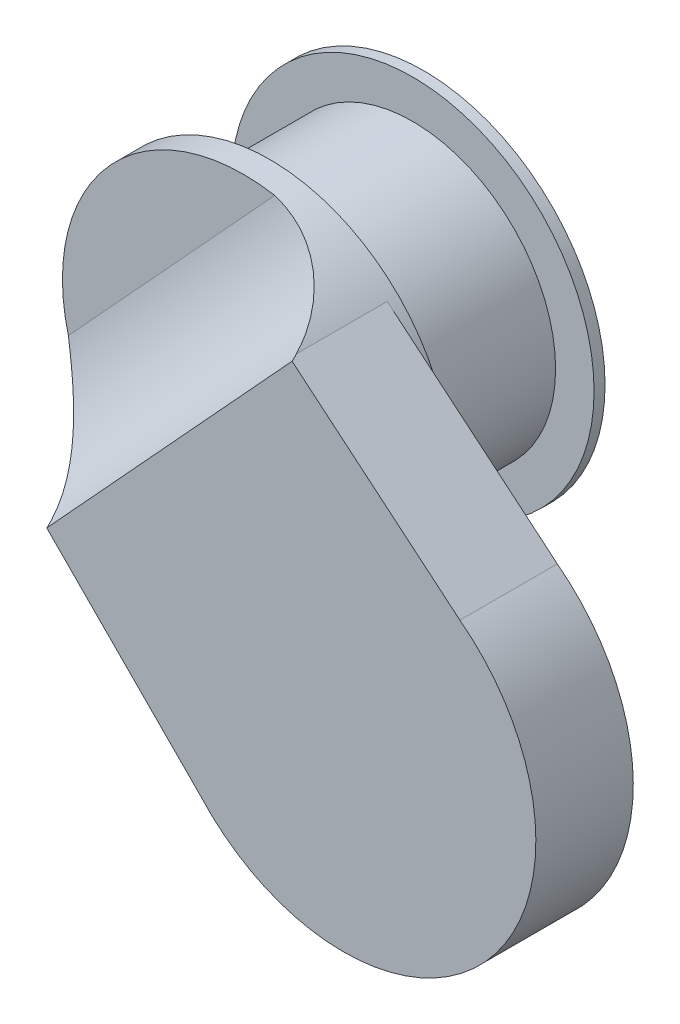
ISO-10303-21;
HEADER;
FILE_DESCRIPTION(('STEP AP214'),'2;1');
FILE_NAME('part.step','',(''),(''),'','','');
FILE_SCHEMA(('AUTOMOTIVE_DESIGN { 1 0 10303 214 1 1 1 1 }'));
ENDSEC;
DATA;
#1=APPLICATION_CONTEXT('core data for automotive mechanical design processes');
#2=APPLICATION_PROTOCOL_DEFINITION('international standard','automotive_design',2000,#1);
#3=PRODUCT_CONTEXT('',#1,'mechanical');
#4=PRODUCT('Part','Part','',(#3));
#5=PRODUCT_RELATED_PRODUCT_CATEGORY('part','',(#4));
#6=PRODUCT_DEFINITION_FORMATION('','',#4);
#7=PRODUCT_DEFINITION_CONTEXT('part definition',#1,'design');
#8=PRODUCT_DEFINITION('design','',#6,#7);
#9=PRODUCT_DEFINITION_SHAPE('','',#8);
#10=(LENGTH_UNIT() NAMED_UNIT(*) SI_UNIT(.MILLI.,.METRE.));
#11=(NAMED_UNIT(*) PLANE_ANGLE_UNIT() SI_UNIT($,.RADIAN.));
#12=(NAMED_UNIT(*) SI_UNIT($,.STERADIAN.) SOLID_ANGLE_UNIT());
#13=UNCERTAINTY_MEASURE_WITH_UNIT(LENGTH_MEASURE(1.E-05),#10,'distance_accuracy_value','');
#14=(GEOMETRIC_REPRESENTATION_CONTEXT(3) GLOBAL_UNCERTAINTY_ASSIGNED_CONTEXT((#13)) GLOBAL_UNIT_ASSIGNED_CONTEXT((#10,
#11,#12)) REPRESENTATION_CONTEXT('',''));
#15=CARTESIAN_POINT('',(0.,0.,0.));
#16=DIRECTION('',(0.,0.,1.));
#17=DIRECTION('',(1.,0.,0.));
#18=AXIS2_PLACEMENT_3D('',#15,#16,#17);
#19=CARTESIAN_POINT('',(-57.4368069571639,52.7732243336127,-361.102462775354));
#20=DIRECTION('',(0.,0.,-1.));
#21=DIRECTION('',(-1.,0.,0.));
#22=AXIS2_PLACEMENT_3D('',#19,#20,#21);
#23=PLANE('',#22);
#24=CARTESIAN_POINT('',(-33.1366193983653,30.4460909616992,-361.102462775354));
#25=DIRECTION('',(0.,0.,1.));
#26=DIRECTION('',(1.,0.,0.));
#27=AXIS2_PLACEMENT_3D('',#24,#25,#26);
#28=CIRCLE('',#27,33.);
#29=CARTESIAN_POINT('',(-0.136619398365269,30.4460909616992,-361.102462775354));
#30=VERTEX_POINT('',#29);
#31=EDGE_CURVE('E20',#30,#30,#28,.T.);
#32=ORIENTED_EDGE('',*,*,#31,.F.);
#33=EDGE_LOOP('',(#32));
#34=FACE_BOUND('',#33,.T.);
#35=ADVANCED_FACE('F17',(#34),#23,.T.);
#36=CARTESIAN_POINT('',(-33.1366193983653,30.4460909616992,71.4239086191774));
#37=DIRECTION('',(0.,0.,1.));
#38=DIRECTION('',(1.,0.,0.));
#39=AXIS2_PLACEMENT_3D('',#36,#37,#38);
#40=CYLINDRICAL_SURFACE('',#39,33.);
#41=CARTESIAN_POINT('',(-33.1366193983653,30.4460909616992,-359.102462775354));
#42=DIRECTION('',(0.,0.,1.));
#43=DIRECTION('',(1.,0.,0.));
#44=AXIS2_PLACEMENT_3D('',#41,#42,#43);
#45=CIRCLE('',#44,33.);
#46=CARTESIAN_POINT('',(-0.136619398365269,30.4460909616992,-359.102462775354));
#47=VERTEX_POINT('',#46);
#48=EDGE_CURVE('E188',#47,#47,#45,.T.);
#49=ORIENTED_EDGE('',*,*,#48,.F.);
#50=EDGE_LOOP('',(#49));
#51=FACE_BOUND('',#50,.T.);
#52=ORIENTED_EDGE('',*,*,#31,.T.);
#53=EDGE_LOOP('',(#52));
#54=FACE_BOUND('',#53,.T.);
#55=ADVANCED_FACE('F145',(#51,#54),#40,.T.);
#56=CARTESIAN_POINT('',(-52.2822217174187,48.0371657395704,-359.102462775354));
#57=DIRECTION('',(0.,0.,1.));
#58=DIRECTION('',(0.,-1.,0.));
#59=AXIS2_PLACEMENT_3D('',#56,#57,#58);
#60=PLANE('',#59);
#61=CARTESIAN_POINT('',(-33.1366193983653,30.4460909616992,-359.102462775354));
#62=DIRECTION('',(0.,0.,1.));
#63=DIRECTION('',(1.,0.,0.));
#64=AXIS2_PLACEMENT_3D('',#61,#62,#63);
#65=CIRCLE('',#64,25.9999999999999);
#66=CARTESIAN_POINT('',(-7.13661939836536,30.4460909616992,-359.102462775354));
#67=VERTEX_POINT('',#66);
#68=EDGE_CURVE('E184',#67,#67,#65,.T.);
#69=ORIENTED_EDGE('',*,*,#68,.F.);
#70=EDGE_LOOP('',(#69));
#71=FACE_BOUND('',#70,.T.);
#72=ORIENTED_EDGE('',*,*,#48,.T.);
#73=EDGE_LOOP('',(#72));
#74=FACE_BOUND('',#73,.T.);
#75=ADVANCED_FACE('F142',(#71,#74),#60,.T.);
#76=CARTESIAN_POINT('',(-33.1366193983653,30.4460909616992,71.4239086191774));
#77=DIRECTION('',(0.,0.,1.));
#78=DIRECTION('',(1.,0.,0.));
#79=AXIS2_PLACEMENT_3D('',#76,#77,#78);
#80=CYLINDRICAL_SURFACE('',#79,25.9999999999999);
#81=CARTESIAN_POINT('',(-33.1366193983653,30.4460909616992,-333.102462775354));
#82=DIRECTION('',(0.,0.,1.));
#83=DIRECTION('',(1.,0.,0.));
#84=AXIS2_PLACEMENT_3D('',#81,#82,#83);
#85=CIRCLE('',#84,25.9999999999999);
#86=CARTESIAN_POINT('',(-7.13661939836536,30.4460909616992,-333.102462775354));
#87=VERTEX_POINT('',#86);
#88=EDGE_CURVE('E181',#87,#87,#85,.T.);
#89=ORIENTED_EDGE('',*,*,#88,.F.);
#90=EDGE_LOOP('',(#89));
#91=FACE_BOUND('',#90,.T.);
#92=ORIENTED_EDGE('',*,*,#68,.T.);
#93=EDGE_LOOP('',(#92));
#94=FACE_BOUND('',#93,.T.);
#95=ADVANCED_FACE('F138',(#91,#94),#80,.T.);
#96=CARTESIAN_POINT('',(-52.2822217174187,48.0371657395704,-333.102462775354));
#97=DIRECTION('',(0.,0.,-1.));
#98=DIRECTION('',(-1.,0.,0.));
#99=AXIS2_PLACEMENT_3D('',#96,#97,#98);
#100=PLANE('',#99);
#101=CARTESIAN_POINT('',(-33.1366193983653,30.4460909616992,-333.102462775354));
#102=DIRECTION('',(0.,0.,1.));
#103=DIRECTION('',(1.,0.,0.));
#104=AXIS2_PLACEMENT_3D('',#101,#102,#103);
#105=CIRCLE('',#104,33.);
#106=CARTESIAN_POINT('',(-0.136619398365269,30.4460909616992,-333.102462775354));
#107=VERTEX_POINT('',#106);
#108=EDGE_CURVE('E79',#107,#107,#105,.T.);
#109=ORIENTED_EDGE('',*,*,#108,.F.);
#110=EDGE_LOOP('',(#109));
#111=FACE_BOUND('',#110,.T.);
#112=ORIENTED_EDGE('',*,*,#88,.T.);
#113=EDGE_LOOP('',(#112));
#114=FACE_BOUND('',#113,.T.);
#115=ADVANCED_FACE('F134',(#111,#114),#100,.T.);
#116=CARTESIAN_POINT('',(-26.9907159954637,85.9098437319744,-328.369237082393));
#117=DIRECTION('',(0.,0.,-1.));
#118=DIRECTION('',(-1.,0.,0.));
#119=AXIS2_PLACEMENT_3D('',#116,#117,#118);
#120=PLANE('',#119);
#121=CARTESIAN_POINT('',(-33.1366193983653,30.4460909616992,-328.369237082393));
#122=DIRECTION('',(0.,0.,1.));
#123=DIRECTION('',(1.,0.,0.));
#124=AXIS2_PLACEMENT_3D('',#121,#122,#123);
#125=CIRCLE('',#124,33.);
#126=CARTESIAN_POINT('',(-65.060484230888,22.0874514698428,-328.369237082393));
#127=VERTEX_POINT('',#126);
#128=CARTESIAN_POINT('',(-27.5047740204313,62.9619688929353,-328.369237082393));
#129=VERTEX_POINT('',#128);
#130=EDGE_CURVE('E80',#127,#129,#125,.F.);
#131=ORIENTED_EDGE('',*,*,#130,.F.);
#132=DIRECTION('',(-0.676579799148893,-0.736369319963593,0.));
#133=VECTOR('',#132,1.);
#134=CARTESIAN_POINT('',(-15.8365381639597,75.6613295797509,-328.369237082393));
#135=LINE('',#134,#133);
#136=EDGE_CURVE('E100',#127,#129,#135,.F.);
#137=ORIENTED_EDGE('',*,*,#136,.T.);
#138=EDGE_LOOP('',(#131,#137));
#139=FACE_BOUND('',#138,.T.);
#140=ADVANCED_FACE('F131',(#139),#120,.F.);
#141=CARTESIAN_POINT('',(-3.60955709766131E-12,-9.37916411203332E-13,-331.102462775354));
#142=DIRECTION('',(0.,0.,1.));
#143=DIRECTION('',(0.,-1.,0.));
#144=AXIS2_PLACEMENT_3D('',#141,#142,#143);
#145=PLANE('',#144);
#146=DIRECTION('',(-0.704061902085778,0.710138604802863,0.));
#147=VECTOR('',#146,1.);
#148=CARTESIAN_POINT('',(-54.3874713497731,5.19928341422212,-331.102462775354));
#149=LINE('',#148,#147);
#150=CARTESIAN_POINT('',(-25.9754752663707,-23.457934365293,-331.102462775354));
#151=VERTEX_POINT('',#150);
#152=CARTESIAN_POINT('',(-54.3874713497731,5.19928341422205,-331.102462775354));
#153=VERTEX_POINT('',#152);
#154=EDGE_CURVE('E83',#151,#153,#149,.T.);
#155=ORIENTED_EDGE('',*,*,#154,.T.);
#156=CARTESIAN_POINT('',(-33.1366193983653,30.4460909616992,-331.102462775354));
#157=DIRECTION('',(0.,0.,1.));
#158=DIRECTION('',(1.,0.,0.));
#159=AXIS2_PLACEMENT_3D('',#156,#157,#158);
#160=CIRCLE('',#159,33.);
#161=CARTESIAN_POINT('',(-9.77532623150931,53.7538146079974,-331.102462775354));
#162=VERTEX_POINT('',#161);
#163=EDGE_CURVE('E66',#162,#153,#160,.F.);
#164=ORIENTED_EDGE('',*,*,#163,.F.);
#165=DIRECTION('',(-0.767078843893344,0.641552840576091,0.));
#166=VECTOR('',#165,1.);
#167=CARTESIAN_POINT('',(-9.77532623150924,53.7538146079974,-331.102462775354));
#168=LINE('',#167,#166);
#169=CARTESIAN_POINT('',(21.1796807697123,27.864334237388,-331.102462775354));
#170=VERTEX_POINT('',#169);
#171=EDGE_CURVE('E103',#170,#162,#168,.T.);
#172=ORIENTED_EDGE('',*,*,#171,.F.);
#173=CARTESIAN_POINT('',(-3.61054131320766E-12,-9.3791640920842E-13,-331.102462775354));
#174=DIRECTION('',(0.,0.,-1.));
#175=DIRECTION('',(-1.,0.,0.));
#176=AXIS2_PLACEMENT_3D('',#173,#174,#175);
#177=CIRCLE('',#176,35.);
#178=EDGE_CURVE('E85',#151,#170,#177,.F.);
#179=ORIENTED_EDGE('',*,*,#178,.F.);
#180=EDGE_LOOP('',(#155,#164,#172,#179));
#181=FACE_BOUND('',#180,.T.);
#182=ADVANCED_FACE('F84',(#181),#145,.F.);
#183=CARTESIAN_POINT('',(-33.1366193983653,30.4460909616992,71.4239086191774));
#184=DIRECTION('',(0.,0.,1.));
#185=DIRECTION('',(1.,0.,0.));
#186=AXIS2_PLACEMENT_3D('',#183,#184,#185);
#187=CYLINDRICAL_SURFACE('',#186,33.);
#188=CARTESIAN_POINT('',(-54.3874713497731,5.19928341422211,-314.571929080083));
#189=CARTESIAN_POINT('',(-54.4972044060166,5.29165331948815,-314.866648936472));
#190=CARTESIAN_POINT('',(-54.6107655652884,5.38845768885528,-315.158515483882));
#191=CARTESIAN_POINT('',(-54.845064350672,5.59116244660017,-315.736155580867));
#192=CARTESIAN_POINT('',(-54.9658021774873,5.69706308940214,-316.021928959735));
#193=CARTESIAN_POINT('',(-55.3380817122,6.02876892416045,-316.869574112397));
#194=CARTESIAN_POINT('',(-55.5996624825485,6.26855560937473,-317.421698847314));
#195=CARTESIAN_POINT('',(-56.1458401965187,6.78772746411218,-318.497867983979));
#196=CARTESIAN_POINT('',(-56.4305133443976,7.06724623679467,-319.021809069313));
#197=CARTESIAN_POINT('',(-57.0169634422458,7.66660740021678,-320.035944557628));
#198=CARTESIAN_POINT('',(-57.3187383784658,7.98644504878478,-320.526142918851));
#199=CARTESIAN_POINT('',(-57.9348031225121,8.6685359141198,-321.470822621476));
#200=CARTESIAN_POINT('',(-58.2491307207187,9.03092476791762,-321.925181580846));
#201=CARTESIAN_POINT('',(-58.8832398291843,9.79763014456871,-322.792989290664));
#202=CARTESIAN_POINT('',(-59.2030215527674,10.2019483105359,-323.206436436631));
#203=CARTESIAN_POINT('',(-59.8407979477898,11.0510381881214,-323.9884504702));
#204=CARTESIAN_POINT('',(-60.1587950135013,11.4957177492152,-324.35711531191));
#205=CARTESIAN_POINT('',(-60.7870288418914,12.4247392605929,-325.048126656473));
#206=CARTESIAN_POINT('',(-61.0972664960761,12.9090766268712,-325.370478500766));
#207=CARTESIAN_POINT('',(-61.6827720516549,13.880566226785,-325.94694353892));
#208=CARTESIAN_POINT('',(-61.9589830104914,14.3652841808162,-326.204207574586));
#209=CARTESIAN_POINT('',(-62.4939459815795,15.3640408650545,-326.676644121629));
#210=CARTESIAN_POINT('',(-62.7526969659512,15.8780813182142,-326.891814156317));
#211=CARTESIAN_POINT('',(-63.248162515508,16.9318762035935,-327.280404590219));
#212=CARTESIAN_POINT('',(-63.4848770504987,17.4716306710451,-327.453824932227));
#213=CARTESIAN_POINT('',(-63.9323294594652,18.5727100502477,-327.760131770447));
#214=CARTESIAN_POINT('',(-64.1430777250841,19.1340262143084,-327.893034513313));
#215=CARTESIAN_POINT('',(-64.4737308763905,20.0944700423522,-328.08462270943));
#216=CARTESIAN_POINT('',(-64.6013372873218,20.4889784223153,-328.153498734393));
#217=CARTESIAN_POINT('',(-64.8419205288448,21.2838756742451,-328.273985238166));
#218=CARTESIAN_POINT('',(-64.9549350573501,21.6842462920096,-328.325640775819));
#219=CARTESIAN_POINT('',(-65.0604842308881,22.0874514698431,-328.369237082393));
#220=B_SPLINE_CURVE_WITH_KNOTS('',3,(#188,#189,#190,#191,#192,#193,#194,#195,#196,#197,#198,
#199,#200,#201,#202,#203,#204,#205,#206,#207,#208,#209,#210,#211,#212,#213,#214,#215,#216,#217,
#218,#219),.UNSPECIFIED.,.F.,.F.,(4,2,2,2,2,2,2,2,2,2,2,2,2,2,2,4),(0.,0.983175991231536,
1.96637949101057,3.93302622098382,5.90644971649867,7.87964132071049,9.8593027865609,
11.8390418601554,13.8143694662105,15.7894690675965,17.6301672448064,19.4709736907317,
21.3117826589001,23.1518525299372,24.4121844463011,25.6691922302524),.UNSPECIFIED.);
#221=CARTESIAN_POINT('',(-54.3874713497731,5.19928341422212,-314.571929080083));
#222=VERTEX_POINT('',#221);
#223=EDGE_CURVE('E102',#222,#127,#220,.T.);
#224=ORIENTED_EDGE('',*,*,#223,.T.);
#225=ORIENTED_EDGE('',*,*,#130,.T.);
#226=CARTESIAN_POINT('',(-27.5047740204315,62.9619688929353,-328.369237082393));
#227=CARTESIAN_POINT('',(-27.2073359921227,62.9104586648119,-328.337656449989));
#228=CARTESIAN_POINT('',(-26.9110349154036,62.8549280235685,-328.301853004664));
#229=CARTESIAN_POINT('',(-26.3211888509705,62.7360323037606,-328.221447562086));
#230=CARTESIAN_POINT('',(-26.0276440775011,62.672666621522,-328.176844886713));
#231=CARTESIAN_POINT('',(-25.4437249353796,62.5382890069471,-328.07847363304));
#232=CARTESIAN_POINT('',(-25.1533518483728,62.467274101006,-328.024701485374));
#233=CARTESIAN_POINT('',(-24.5764505028791,62.3179020437612,-327.907710733053));
#234=CARTESIAN_POINT('',(-24.2899221497912,62.2395450734916,-327.844492361293));
#235=CARTESIAN_POINT('',(-23.4377571088984,61.9941619585203,-327.640455483783));
#236=CARTESIAN_POINT('',(-22.8785085852482,61.8165848996955,-327.485083977187));
#237=CARTESIAN_POINT('',(-21.7817433174637,61.4364725587959,-327.134038037701));
#238=CARTESIAN_POINT('',(-21.2442225896833,61.2339418796178,-326.938371033184));
#239=CARTESIAN_POINT('',(-20.1930786185697,60.8070438483552,-326.505333330241));
#240=CARTESIAN_POINT('',(-19.6795323609832,60.5826124628,-326.267838601199));
#241=CARTESIAN_POINT('',(-18.6815688665992,60.1168648043722,-325.751678933644));
#242=CARTESIAN_POINT('',(-18.1971539090521,59.8755472135006,-325.47301077958));
#243=CARTESIAN_POINT('',(-17.2606251093417,59.3810711305172,-324.875662239081));
#244=CARTESIAN_POINT('',(-16.8084908460235,59.1279202950469,-324.557007506904));
#245=CARTESIAN_POINT('',(-15.9382632600914,58.6147218226695,-323.881191388692));
#246=CARTESIAN_POINT('',(-15.5201686057023,58.3546744561125,-323.524031510415));
#247=CARTESIAN_POINT('',(-14.7279773701887,57.8384368583566,-322.781496594512));
#248=CARTESIAN_POINT('',(-14.3531234277436,57.5822852316745,-322.396901129522));
#249=CARTESIAN_POINT('',(-13.6377347058633,57.0728888961467,-321.595231342357));
#250=CARTESIAN_POINT('',(-13.2972019598855,56.8196443603268,-321.178155098356));
#251=CARTESIAN_POINT('',(-12.6503457245766,56.3203952836265,-320.313882325968));
#252=CARTESIAN_POINT('',(-12.3440375776587,56.0743940259109,-319.866672431944));
#253=CARTESIAN_POINT('',(-11.765483234377,55.5939721348902,-318.945081247966));
#254=CARTESIAN_POINT('',(-11.4932292979521,55.3595488774191,-318.470706168155));
#255=CARTESIAN_POINT('',(-10.9531663300142,54.8804730294538,-317.442413234685));
#256=CARTESIAN_POINT('',(-10.6893126173041,54.637642741415,-316.885554589889));
#257=CARTESIAN_POINT('',(-10.3239861541438,54.2916727591784,-316.031213594637));
#258=CARTESIAN_POINT('',(-10.2074286532057,54.1795399306989,-315.743674515867));
#259=CARTESIAN_POINT('',(-9.98408742833909,53.9617142754599,-315.162365306784));
#260=CARTESIAN_POINT('',(-9.87730533067873,53.8560225212329,-314.868594149657));
#261=CARTESIAN_POINT('',(-9.77532623150925,53.7538146079974,-314.571929080083));
#262=B_SPLINE_CURVE_WITH_KNOTS('',3,(#226,#227,#228,#229,#230,#231,#232,#233,#234,#235,#236,
#237,#238,#239,#240,#241,#242,#243,#244,#245,#246,#247,#248,#249,#250,#251,#252,#253,#254,#255,
#256,#257,#258,#259,#260,#261),.UNSPECIFIED.,.F.,.F.,(4,2,2,2,2,2,2,2,2,2,2,2,2,2,2,2,2,4),(0.,
0.910490257527136,1.82105071024242,2.73196642599118,3.64285968711328,5.46143766172319,
7.27968068574604,9.10340897159347,10.9272797618756,12.7499863341692,14.5726215600755,
16.3557422695086,18.138968562995,19.9229910717088,21.7066073565858,23.6911396563618,
24.6806328303354,25.6702903216281),.UNSPECIFIED.);
#263=CARTESIAN_POINT('',(-9.77532623150924,53.7538146079974,-314.571929080083));
#264=VERTEX_POINT('',#263);
#265=EDGE_CURVE('E88',#129,#264,#262,.T.);
#266=ORIENTED_EDGE('',*,*,#265,.T.);
#267=DIRECTION('',(0.,0.,1.));
#268=VECTOR('',#267,1.);
#269=CARTESIAN_POINT('',(-9.77532623150924,53.7538146079974,-313.372462775354));
#270=LINE('',#269,#268);
#271=EDGE_CURVE('E75',#162,#264,#270,.T.);
#272=ORIENTED_EDGE('',*,*,#271,.F.);
#273=ORIENTED_EDGE('',*,*,#163,.T.);
#274=DIRECTION('',(0.,0.,1.));
#275=VECTOR('',#274,1.);
#276=CARTESIAN_POINT('',(-54.3874713497731,5.19928341422212,-313.372462775354));
#277=LINE('',#276,#275);
#278=EDGE_CURVE('E72',#153,#222,#277,.T.);
#279=ORIENTED_EDGE('',*,*,#278,.T.);
#280=EDGE_LOOP('',(#224,#225,#266,#272,#273,#279));
#281=FACE_BOUND('',#280,.T.);
#282=ORIENTED_EDGE('',*,*,#108,.T.);
#283=EDGE_LOOP('',(#282));
#284=FACE_BOUND('',#283,.T.);
#285=ADVANCED_FACE('F69',(#281,#284),#187,.T.);
#286=CARTESIAN_POINT('',(-18.0962882731668,77.7375992362456,-303.702808429313));
#287=DIRECTION('',(-0.676579799148893,-0.736369319963593,0.));
#288=DIRECTION('',(0.736369319963593,-0.676579799148893,0.));
#289=AXIS2_PLACEMENT_3D('',#286,#287,#288);
#290=CYLINDRICAL_SURFACE('',#289,24.8565900465059);
#291=ORIENTED_EDGE('',*,*,#136,.F.);
#292=ORIENTED_EDGE('',*,*,#223,.F.);
#293=CARTESIAN_POINT('',(-70.1433386703332,21.0911383822791,-303.702808429313));
#294=DIRECTION('',(0.710138604802863,0.704061902085778,0.));
#295=DIRECTION('',(0.704061902085778,-0.710138604802863,0.));
#296=AXIS2_PLACEMENT_3D('',#293,#294,#295);
#297=ELLIPSE('',#296,24.8835882755424,24.8565900465059);
#298=CARTESIAN_POINT('',(-54.0037653528604,4.81226568112956,-313.372462775354));
#299=VERTEX_POINT('',#298);
#300=EDGE_CURVE('E93',#222,#299,#297,.F.);
#301=ORIENTED_EDGE('',*,*,#300,.T.);
#302=DIRECTION('',(-0.676579799148893,-0.736369319963593,0.));
#303=VECTOR('',#302,1.);
#304=CARTESIAN_POINT('',(-9.3572766940541,53.4041753624479,-313.372462775354));
#305=LINE('',#304,#303);
#306=CARTESIAN_POINT('',(-9.3572766940541,53.4041753624479,-313.372462775354));
#307=VERTEX_POINT('',#306);
#308=EDGE_CURVE('E200',#307,#299,#305,.T.);
#309=ORIENTED_EDGE('',*,*,#308,.F.);
#310=CARTESIAN_POINT('',(-26.9414197994007,68.1108212934888,-303.702808429313));
#311=DIRECTION('',(0.641552840576091,0.767078843893344,0.));
#312=DIRECTION('',(-0.767078843893344,0.641552840576091,0.));
#313=AXIS2_PLACEMENT_3D('',#310,#311,#312);
#314=ELLIPSE('',#313,24.8835882755424,24.8565900465059);
#315=EDGE_CURVE('E108',#264,#307,#314,.F.);
#316=ORIENTED_EDGE('',*,*,#315,.F.);
#317=ORIENTED_EDGE('',*,*,#265,.F.);
#318=EDGE_LOOP('',(#291,#292,#301,#309,#316,#317));
#319=FACE_BOUND('',#318,.T.);
#320=ADVANCED_FACE('F122',(#319),#290,.F.);
#321=CARTESIAN_POINT('',(-54.3874713497731,5.19928341422212,-313.372462775354));
#322=DIRECTION('',(0.710138604802863,0.704061902085778,0.));
#323=DIRECTION('',(-0.704061902085778,0.710138604802863,0.));
#324=AXIS2_PLACEMENT_3D('',#321,#322,#323);
#325=PLANE('',#324);
#326=ORIENTED_EDGE('',*,*,#300,.F.);
#327=ORIENTED_EDGE('',*,*,#278,.F.);
#328=ORIENTED_EDGE('',*,*,#154,.F.);
#329=DIRECTION('',(0.,0.,-1.));
#330=VECTOR('',#329,1.);
#331=CARTESIAN_POINT('',(-25.9754752663707,-23.457934365293,-313.372462775354));
#332=LINE('',#331,#330);
#333=CARTESIAN_POINT('',(-25.9754752663707,-23.457934365293,-313.372462775354));
#334=VERTEX_POINT('',#333);
#335=EDGE_CURVE('E95',#334,#151,#332,.T.);
#336=ORIENTED_EDGE('',*,*,#335,.F.);
#337=DIRECTION('',(0.704061902085777,-0.710138604802863,0.));
#338=VECTOR('',#337,1.);
#339=CARTESIAN_POINT('',(-54.0037653528604,4.81226568112956,-313.372462775354));
#340=LINE('',#339,#338);
#341=EDGE_CURVE('E107',#299,#334,#340,.T.);
#342=ORIENTED_EDGE('',*,*,#341,.F.);
#343=EDGE_LOOP('',(#326,#327,#328,#336,#342));
#344=FACE_BOUND('',#343,.T.);
#345=ADVANCED_FACE('F91',(#344),#325,.F.);
#346=CARTESIAN_POINT('',(-3.60955709766131E-12,-9.37916411203332E-13,-313.372462775354));
#347=DIRECTION('',(0.,0.,-1.));
#348=DIRECTION('',(-1.,0.,0.));
#349=AXIS2_PLACEMENT_3D('',#346,#347,#348);
#350=CYLINDRICAL_SURFACE('',#349,35.);
#351=ORIENTED_EDGE('',*,*,#178,.T.);
#352=DIRECTION('',(0.,0.,1.));
#353=VECTOR('',#352,1.);
#354=CARTESIAN_POINT('',(21.1796807697122,27.8643342373881,-313.372462775354));
#355=LINE('',#354,#353);
#356=CARTESIAN_POINT('',(21.1796807697124,27.864334237388,-313.372462775354));
#357=VERTEX_POINT('',#356);
#358=EDGE_CURVE('E35',#357,#170,#355,.F.);
#359=ORIENTED_EDGE('',*,*,#358,.F.);
#360=CARTESIAN_POINT('',(-3.60955709766131E-12,-9.37916411203332E-13,-313.372462775354));
#361=DIRECTION('',(0.,0.,-1.));
#362=DIRECTION('',(-1.,0.,0.));
#363=AXIS2_PLACEMENT_3D('',#360,#361,#362);
#364=CIRCLE('',#363,35.);
#365=EDGE_CURVE('E26',#334,#357,#364,.F.);
#366=ORIENTED_EDGE('',*,*,#365,.F.);
#367=ORIENTED_EDGE('',*,*,#335,.T.);
#368=EDGE_LOOP('',(#351,#359,#366,#367));
#369=FACE_BOUND('',#368,.T.);
#370=ADVANCED_FACE('F164',(#369),#350,.T.);
#371=CARTESIAN_POINT('',(-9.77532623150924,53.7538146079974,-313.372462775354));
#372=DIRECTION('',(0.641552840576091,0.767078843893344,0.));
#373=DIRECTION('',(-0.767078843893344,0.641552840576091,0.));
#374=AXIS2_PLACEMENT_3D('',#371,#372,#373);
#375=PLANE('',#374);
#376=ORIENTED_EDGE('',*,*,#171,.T.);
#377=ORIENTED_EDGE('',*,*,#271,.T.);
#378=ORIENTED_EDGE('',*,*,#315,.T.);
#379=DIRECTION('',(-0.767078843893344,0.641552840576091,0.));
#380=VECTOR('',#379,1.);
#381=CARTESIAN_POINT('',(21.1796807697122,27.8643342373881,-313.372462775354));
#382=LINE('',#381,#380);
#383=EDGE_CURVE('E11',#357,#307,#382,.T.);
#384=ORIENTED_EDGE('',*,*,#383,.F.);
#385=ORIENTED_EDGE('',*,*,#358,.T.);
#386=EDGE_LOOP('',(#376,#377,#378,#384,#385));
#387=FACE_BOUND('',#386,.T.);
#388=ADVANCED_FACE('F158',(#387),#375,.T.);
#389=CARTESIAN_POINT('',(-3.60955709766131E-12,-9.37916411203332E-13,-313.372462775354));
#390=DIRECTION('',(0.,0.,1.));
#391=DIRECTION('',(0.,-1.,0.));
#392=AXIS2_PLACEMENT_3D('',#389,#390,#391);
#393=PLANE('',#392);
#394=ORIENTED_EDGE('',*,*,#365,.T.);
#395=ORIENTED_EDGE('',*,*,#383,.T.);
#396=ORIENTED_EDGE('',*,*,#308,.T.);
#397=ORIENTED_EDGE('',*,*,#341,.T.);
#398=EDGE_LOOP('',(#394,#395,#396,#397));
#399=FACE_BOUND('',#398,.T.);
#400=ADVANCED_FACE('F156',(#399),#393,.T.);
#401=CLOSED_SHELL('',(#35,#55,#75,#95,#115,#140,#182,#285,#320,#345,#370,#388,#400));
#402=MANIFOLD_SOLID_BREP('B1',#401);
#403=ADVANCED_BREP_SHAPE_REPRESENTATION('',(#18,#402),#14);
#404=SHAPE_DEFINITION_REPRESENTATION(#9,#403);
ENDSEC;
END-ISO-10303-21;
